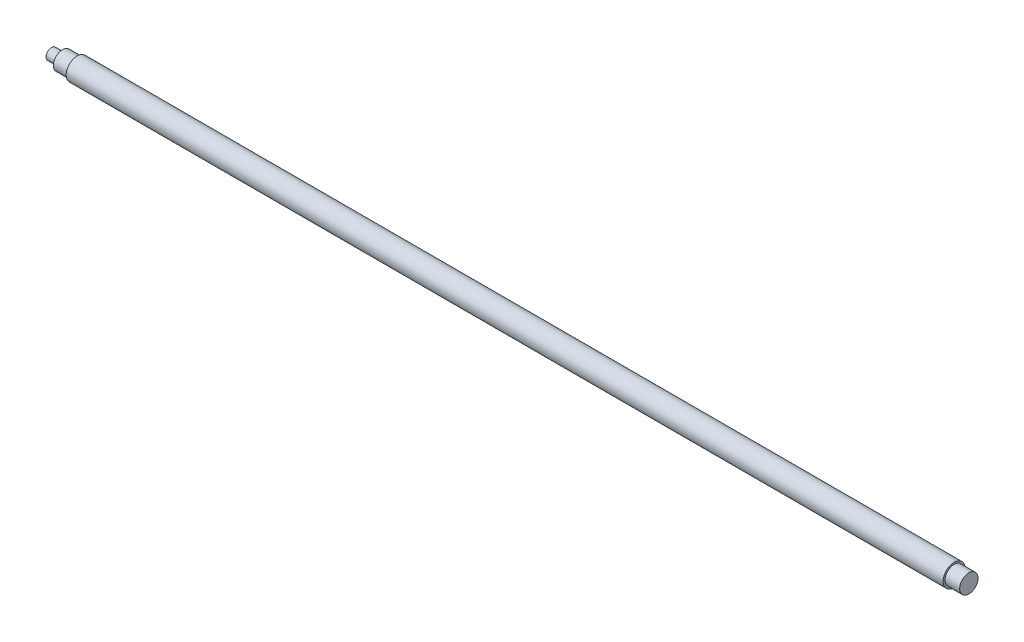
ISO-10303-21;
HEADER;
FILE_DESCRIPTION(('STEP AP214'),'2;1');
FILE_NAME('part.step','',(''),(''),'','','');
FILE_SCHEMA(('AUTOMOTIVE_DESIGN { 1 0 10303 214 1 1 1 1 }'));
ENDSEC;
DATA;
#1=APPLICATION_CONTEXT('core data for automotive mechanical design processes');
#2=APPLICATION_PROTOCOL_DEFINITION('international standard','automotive_design',2000,#1);
#3=PRODUCT_CONTEXT('',#1,'mechanical');
#4=PRODUCT('Part','Part','',(#3));
#5=PRODUCT_RELATED_PRODUCT_CATEGORY('part','',(#4));
#6=PRODUCT_DEFINITION_FORMATION('','',#4);
#7=PRODUCT_DEFINITION_CONTEXT('part definition',#1,'design');
#8=PRODUCT_DEFINITION('design','',#6,#7);
#9=PRODUCT_DEFINITION_SHAPE('','',#8);
#10=(LENGTH_UNIT() NAMED_UNIT(*) SI_UNIT(.MILLI.,.METRE.));
#11=(NAMED_UNIT(*) PLANE_ANGLE_UNIT() SI_UNIT($,.RADIAN.));
#12=(NAMED_UNIT(*) SI_UNIT($,.STERADIAN.) SOLID_ANGLE_UNIT());
#13=UNCERTAINTY_MEASURE_WITH_UNIT(LENGTH_MEASURE(1.E-05),#10,'distance_accuracy_value','');
#14=(GEOMETRIC_REPRESENTATION_CONTEXT(3) GLOBAL_UNCERTAINTY_ASSIGNED_CONTEXT((#13)) GLOBAL_UNIT_ASSIGNED_CONTEXT((#10,
#11,#12)) REPRESENTATION_CONTEXT('',''));
#15=CARTESIAN_POINT('',(0.,0.,0.));
#16=DIRECTION('',(0.,0.,1.));
#17=DIRECTION('',(1.,0.,0.));
#18=AXIS2_PLACEMENT_3D('',#15,#16,#17);
#19=CARTESIAN_POINT('',(0.,0.,0.));
#20=DIRECTION('',(1.,0.,0.));
#21=DIRECTION('',(0.,0.,-1.));
#22=AXIS2_PLACEMENT_3D('',#19,#20,#21);
#23=PLANE('',#22);
#24=CARTESIAN_POINT('',(0.,0.,0.));
#25=DIRECTION('',(-1.,0.,0.));
#26=DIRECTION('',(0.,0.,1.));
#27=AXIS2_PLACEMENT_3D('',#24,#25,#26);
#28=CIRCLE('',#27,3.);
#29=CARTESIAN_POINT('',(0.,0.,3.));
#30=VERTEX_POINT('',#29);
#31=EDGE_CURVE('E10',#30,#30,#28,.T.);
#32=ORIENTED_EDGE('',*,*,#31,.T.);
#33=EDGE_LOOP('',(#32));
#34=FACE_BOUND('',#33,.T.);
#35=ADVANCED_FACE('F31',(#34),#23,.F.);
#36=CARTESIAN_POINT('',(0.,0.,0.));
#37=DIRECTION('',(-1.,0.,0.));
#38=DIRECTION('',(0.,0.,1.));
#39=AXIS2_PLACEMENT_3D('',#36,#37,#38);
#40=CYLINDRICAL_SURFACE('',#39,3.);
#41=ORIENTED_EDGE('',*,*,#31,.F.);
#42=EDGE_LOOP('',(#41));
#43=FACE_BOUND('',#42,.T.);
#44=CARTESIAN_POINT('',(6.,0.,0.));
#45=DIRECTION('',(-1.,0.,0.));
#46=DIRECTION('',(0.,0.,1.));
#47=AXIS2_PLACEMENT_3D('',#44,#45,#46);
#48=CIRCLE('',#47,3.);
#49=CARTESIAN_POINT('',(6.,0.,3.));
#50=VERTEX_POINT('',#49);
#51=EDGE_CURVE('E37',#50,#50,#48,.T.);
#52=ORIENTED_EDGE('',*,*,#51,.T.);
#53=EDGE_LOOP('',(#52));
#54=FACE_BOUND('',#53,.T.);
#55=ADVANCED_FACE('F75',(#43,#54),#40,.T.);
#56=CARTESIAN_POINT('',(6.,3.,0.));
#57=DIRECTION('',(1.,0.,0.));
#58=DIRECTION('',(0.,0.,-1.));
#59=AXIS2_PLACEMENT_3D('',#56,#57,#58);
#60=PLANE('',#59);
#61=ORIENTED_EDGE('',*,*,#51,.F.);
#62=EDGE_LOOP('',(#61));
#63=FACE_BOUND('',#62,.T.);
#64=CARTESIAN_POINT('',(6.,0.,0.));
#65=DIRECTION('',(-1.,0.,0.));
#66=DIRECTION('',(0.,0.,1.));
#67=AXIS2_PLACEMENT_3D('',#64,#65,#66);
#68=CIRCLE('',#67,5.);
#69=CARTESIAN_POINT('',(6.,0.,5.));
#70=VERTEX_POINT('',#69);
#71=EDGE_CURVE('E41',#70,#70,#68,.T.);
#72=ORIENTED_EDGE('',*,*,#71,.T.);
#73=EDGE_LOOP('',(#72));
#74=FACE_BOUND('',#73,.T.);
#75=ADVANCED_FACE('F79',(#63,#74),#60,.F.);
#76=CARTESIAN_POINT('',(0.,0.,0.));
#77=DIRECTION('',(-1.,0.,0.));
#78=DIRECTION('',(0.,0.,1.));
#79=AXIS2_PLACEMENT_3D('',#76,#77,#78);
#80=CYLINDRICAL_SURFACE('',#79,5.);
#81=ORIENTED_EDGE('',*,*,#71,.F.);
#82=EDGE_LOOP('',(#81));
#83=FACE_BOUND('',#82,.T.);
#84=CARTESIAN_POINT('',(14.,0.,0.));
#85=DIRECTION('',(-1.,0.,0.));
#86=DIRECTION('',(0.,0.,1.));
#87=AXIS2_PLACEMENT_3D('',#84,#85,#86);
#88=CIRCLE('',#87,5.);
#89=CARTESIAN_POINT('',(14.,0.,5.));
#90=VERTEX_POINT('',#89);
#91=EDGE_CURVE('E45',#90,#90,#88,.T.);
#92=ORIENTED_EDGE('',*,*,#91,.T.);
#93=EDGE_LOOP('',(#92));
#94=FACE_BOUND('',#93,.T.);
#95=ADVANCED_FACE('F84',(#83,#94),#80,.T.);
#96=CARTESIAN_POINT('',(14.,5.,0.));
#97=DIRECTION('',(1.,0.,0.));
#98=DIRECTION('',(0.,0.,-1.));
#99=AXIS2_PLACEMENT_3D('',#96,#97,#98);
#100=PLANE('',#99);
#101=ORIENTED_EDGE('',*,*,#91,.F.);
#102=EDGE_LOOP('',(#101));
#103=FACE_BOUND('',#102,.T.);
#104=CARTESIAN_POINT('',(14.,0.,0.));
#105=DIRECTION('',(-1.,0.,0.));
#106=DIRECTION('',(0.,0.,1.));
#107=AXIS2_PLACEMENT_3D('',#104,#105,#106);
#108=CIRCLE('',#107,6.);
#109=CARTESIAN_POINT('',(14.,0.,6.));
#110=VERTEX_POINT('',#109);
#111=EDGE_CURVE('E50',#110,#110,#108,.T.);
#112=ORIENTED_EDGE('',*,*,#111,.T.);
#113=EDGE_LOOP('',(#112));
#114=FACE_BOUND('',#113,.T.);
#115=ADVANCED_FACE('F90',(#103,#114),#100,.F.);
#116=CARTESIAN_POINT('',(0.,0.,0.));
#117=DIRECTION('',(-1.,0.,0.));
#118=DIRECTION('',(0.,0.,1.));
#119=AXIS2_PLACEMENT_3D('',#116,#117,#118);
#120=CYLINDRICAL_SURFACE('',#119,6.);
#121=ORIENTED_EDGE('',*,*,#111,.F.);
#122=EDGE_LOOP('',(#121));
#123=FACE_BOUND('',#122,.T.);
#124=CARTESIAN_POINT('',(492.,0.,0.));
#125=DIRECTION('',(-1.,0.,0.));
#126=DIRECTION('',(0.,0.,1.));
#127=AXIS2_PLACEMENT_3D('',#124,#125,#126);
#128=CIRCLE('',#127,6.);
#129=CARTESIAN_POINT('',(492.,0.,6.));
#130=VERTEX_POINT('',#129);
#131=EDGE_CURVE('E53',#130,#130,#128,.T.);
#132=ORIENTED_EDGE('',*,*,#131,.T.);
#133=EDGE_LOOP('',(#132));
#134=FACE_BOUND('',#133,.T.);
#135=ADVANCED_FACE('F94',(#123,#134),#120,.T.);
#136=CARTESIAN_POINT('',(492.,6.,0.));
#137=DIRECTION('',(-1.,0.,0.));
#138=DIRECTION('',(0.,0.,1.));
#139=AXIS2_PLACEMENT_3D('',#136,#137,#138);
#140=PLANE('',#139);
#141=ORIENTED_EDGE('',*,*,#131,.F.);
#142=EDGE_LOOP('',(#141));
#143=FACE_BOUND('',#142,.T.);
#144=CARTESIAN_POINT('',(492.,0.,0.));
#145=DIRECTION('',(-1.,0.,0.));
#146=DIRECTION('',(0.,0.,1.));
#147=AXIS2_PLACEMENT_3D('',#144,#145,#146);
#148=CIRCLE('',#147,5.);
#149=CARTESIAN_POINT('',(492.,0.,5.));
#150=VERTEX_POINT('',#149);
#151=EDGE_CURVE('E56',#150,#150,#148,.T.);
#152=ORIENTED_EDGE('',*,*,#151,.T.);
#153=EDGE_LOOP('',(#152));
#154=FACE_BOUND('',#153,.T.);
#155=ADVANCED_FACE('F71',(#143,#154),#140,.F.);
#156=CARTESIAN_POINT('',(0.,0.,0.));
#157=DIRECTION('',(-1.,0.,0.));
#158=DIRECTION('',(0.,0.,1.));
#159=AXIS2_PLACEMENT_3D('',#156,#157,#158);
#160=CYLINDRICAL_SURFACE('',#159,5.);
#161=ORIENTED_EDGE('',*,*,#151,.F.);
#162=EDGE_LOOP('',(#161));
#163=FACE_BOUND('',#162,.T.);
#164=CARTESIAN_POINT('',(500.,0.,0.));
#165=DIRECTION('',(-1.,0.,0.));
#166=DIRECTION('',(0.,0.,1.));
#167=AXIS2_PLACEMENT_3D('',#164,#165,#166);
#168=CIRCLE('',#167,5.);
#169=CARTESIAN_POINT('',(500.,0.,5.));
#170=VERTEX_POINT('',#169);
#171=EDGE_CURVE('E59',#170,#170,#168,.T.);
#172=ORIENTED_EDGE('',*,*,#171,.T.);
#173=EDGE_LOOP('',(#172));
#174=FACE_BOUND('',#173,.T.);
#175=ADVANCED_FACE('F63',(#163,#174),#160,.T.);
#176=CARTESIAN_POINT('',(500.,5.,0.));
#177=DIRECTION('',(-1.,0.,0.));
#178=DIRECTION('',(0.,0.,1.));
#179=AXIS2_PLACEMENT_3D('',#176,#177,#178);
#180=PLANE('',#179);
#181=ORIENTED_EDGE('',*,*,#171,.F.);
#182=EDGE_LOOP('',(#181));
#183=FACE_BOUND('',#182,.T.);
#184=ADVANCED_FACE('F65',(#183),#180,.F.);
#185=CLOSED_SHELL('',(#35,#55,#75,#95,#115,#135,#155,#175,#184));
#186=MANIFOLD_SOLID_BREP('B2',#185);
#187=ADVANCED_BREP_SHAPE_REPRESENTATION('',(#18,#186),#14);
#188=SHAPE_DEFINITION_REPRESENTATION(#9,#187);
ENDSEC;
END-ISO-10303-21;
